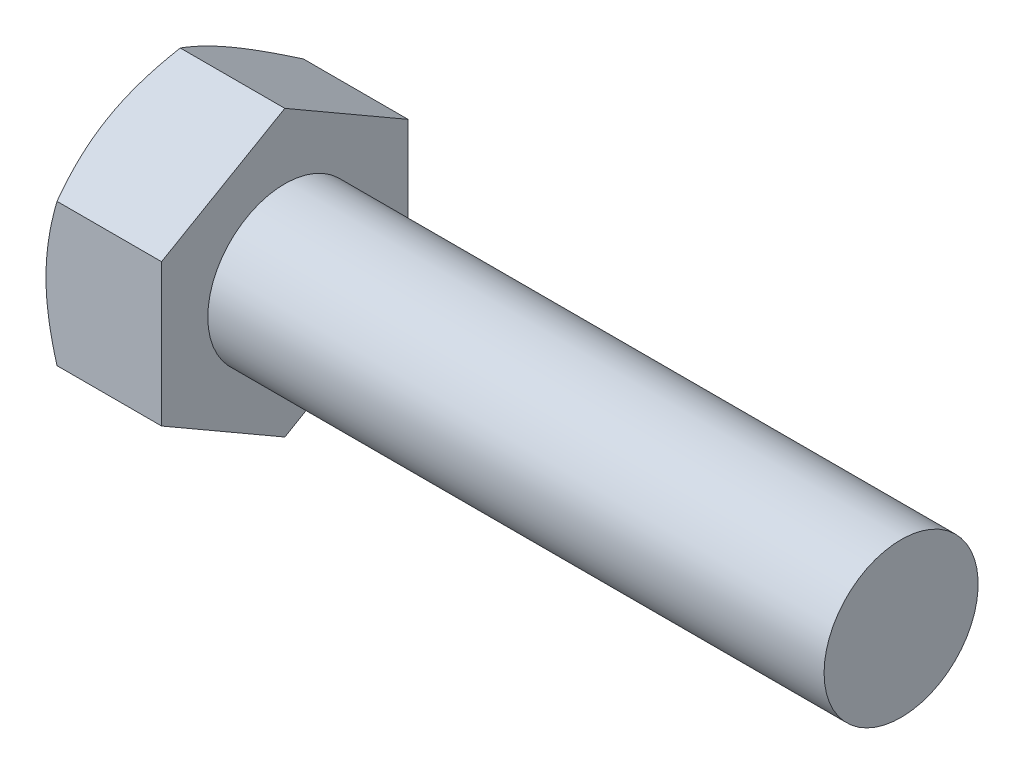
ISO-10303-21;
HEADER;
FILE_DESCRIPTION(('STEP AP214'),'2;1');
FILE_NAME('part.step','',(''),(''),'','','');
FILE_SCHEMA(('AUTOMOTIVE_DESIGN { 1 0 10303 214 1 1 1 1 }'));
ENDSEC;
DATA;
#1=APPLICATION_CONTEXT('core data for automotive mechanical design processes');
#2=APPLICATION_PROTOCOL_DEFINITION('international standard','automotive_design',2000,#1);
#3=PRODUCT_CONTEXT('',#1,'mechanical');
#4=PRODUCT('Part','Part','',(#3));
#5=PRODUCT_RELATED_PRODUCT_CATEGORY('part','',(#4));
#6=PRODUCT_DEFINITION_FORMATION('','',#4);
#7=PRODUCT_DEFINITION_CONTEXT('part definition',#1,'design');
#8=PRODUCT_DEFINITION('design','',#6,#7);
#9=PRODUCT_DEFINITION_SHAPE('','',#8);
#10=(LENGTH_UNIT() NAMED_UNIT(*) SI_UNIT(.MILLI.,.METRE.));
#11=(NAMED_UNIT(*) PLANE_ANGLE_UNIT() SI_UNIT($,.RADIAN.));
#12=(NAMED_UNIT(*) SI_UNIT($,.STERADIAN.) SOLID_ANGLE_UNIT());
#13=UNCERTAINTY_MEASURE_WITH_UNIT(LENGTH_MEASURE(1.E-05),#10,'distance_accuracy_value','');
#14=(GEOMETRIC_REPRESENTATION_CONTEXT(3) GLOBAL_UNCERTAINTY_ASSIGNED_CONTEXT((#13)) GLOBAL_UNIT_ASSIGNED_CONTEXT((#10,
#11,#12)) REPRESENTATION_CONTEXT('',''));
#15=CARTESIAN_POINT('',(0.,0.,0.));
#16=DIRECTION('',(0.,0.,1.));
#17=DIRECTION('',(1.,0.,0.));
#18=AXIS2_PLACEMENT_3D('',#15,#16,#17);
#19=CARTESIAN_POINT('',(7.5,4.99999999999999,0.));
#20=DIRECTION('',(-1.,0.,0.));
#21=DIRECTION('',(0.,0.,1.));
#22=AXIS2_PLACEMENT_3D('',#19,#20,#21);
#23=PLANE('',#22);
#24=CARTESIAN_POINT('',(7.5,0.,0.));
#25=DIRECTION('',(-1.,0.,0.));
#26=DIRECTION('',(0.,0.,1.));
#27=AXIS2_PLACEMENT_3D('',#24,#25,#26);
#28=CIRCLE('',#27,4.99999999999999);
#29=CARTESIAN_POINT('',(7.5,0.,4.99999999999999));
#30=VERTEX_POINT('',#29);
#31=EDGE_CURVE('E191',#30,#30,#28,.T.);
#32=ORIENTED_EDGE('',*,*,#31,.T.);
#33=EDGE_LOOP('',(#32));
#34=FACE_BOUND('',#33,.T.);
#35=DIRECTION('',(0.,1.,0.));
#36=VECTOR('',#35,1.);
#37=CARTESIAN_POINT('',(7.5,-4.61880217370055,8.));
#38=LINE('',#37,#36);
#39=CARTESIAN_POINT('',(7.5,-4.61880217370055,8.));
#40=VERTEX_POINT('',#39);
#41=CARTESIAN_POINT('',(7.5,4.61880217370081,8.));
#42=VERTEX_POINT('',#41);
#43=EDGE_CURVE('E55',#40,#42,#38,.T.);
#44=ORIENTED_EDGE('',*,*,#43,.F.);
#45=DIRECTION('',(0.,0.50000000163871,0.866025402838329));
#46=VECTOR('',#45,1.);
#47=CARTESIAN_POINT('',(7.5,-9.23760434740123,0.));
#48=LINE('',#47,#46);
#49=CARTESIAN_POINT('',(7.5,-9.23760434740123,0.));
#50=VERTEX_POINT('',#49);
#51=EDGE_CURVE('E128',#50,#40,#48,.T.);
#52=ORIENTED_EDGE('',*,*,#51,.F.);
#53=DIRECTION('',(0.,-0.50000000163871,0.866025402838329));
#54=VECTOR('',#53,1.);
#55=CARTESIAN_POINT('',(7.5,-4.61880217370055,-8.));
#56=LINE('',#55,#54);
#57=CARTESIAN_POINT('',(7.5,-4.61880217370055,-8.));
#58=VERTEX_POINT('',#57);
#59=EDGE_CURVE('E126',#58,#50,#56,.T.);
#60=ORIENTED_EDGE('',*,*,#59,.F.);
#61=DIRECTION('',(0.,-1.,0.));
#62=VECTOR('',#61,1.);
#63=CARTESIAN_POINT('',(7.5,4.61880217370081,-8.));
#64=LINE('',#63,#62);
#65=CARTESIAN_POINT('',(7.5,4.61880217370081,-8.));
#66=VERTEX_POINT('',#65);
#67=EDGE_CURVE('E109',#66,#58,#64,.T.);
#68=ORIENTED_EDGE('',*,*,#67,.F.);
#69=DIRECTION('',(0.,-0.50000000163871,-0.866025402838329));
#70=VECTOR('',#69,1.);
#71=CARTESIAN_POINT('',(7.5,9.23760434740149,0.));
#72=LINE('',#71,#70);
#73=CARTESIAN_POINT('',(7.5,9.23760434740148,0.));
#74=VERTEX_POINT('',#73);
#75=EDGE_CURVE('E118',#74,#66,#72,.T.);
#76=ORIENTED_EDGE('',*,*,#75,.F.);
#77=DIRECTION('',(0.,0.50000000163871,-0.866025402838329));
#78=VECTOR('',#77,1.);
#79=CARTESIAN_POINT('',(7.5,4.61880217370081,8.));
#80=LINE('',#79,#78);
#81=EDGE_CURVE('E122',#42,#74,#80,.T.);
#82=ORIENTED_EDGE('',*,*,#81,.F.);
#83=EDGE_LOOP('',(#44,#52,#60,#68,#76,#82));
#84=FACE_BOUND('',#83,.T.);
#85=ADVANCED_FACE('F32',(#34,#84),#23,.F.);
#86=CARTESIAN_POINT('',(-25.4,0.,0.));
#87=DIRECTION('',(-1.,0.,0.));
#88=DIRECTION('',(0.,0.,1.));
#89=AXIS2_PLACEMENT_3D('',#86,#87,#88);
#90=CYLINDRICAL_SURFACE('',#89,4.99999999999999);
#91=CARTESIAN_POINT('',(47.5,0.,0.));
#92=DIRECTION('',(-1.,0.,0.));
#93=DIRECTION('',(0.,0.,1.));
#94=AXIS2_PLACEMENT_3D('',#91,#92,#93);
#95=CIRCLE('',#94,4.99999999999999);
#96=CARTESIAN_POINT('',(47.5,0.,4.99999999999999));
#97=VERTEX_POINT('',#96);
#98=EDGE_CURVE('E11',#97,#97,#95,.T.);
#99=ORIENTED_EDGE('',*,*,#98,.T.);
#100=EDGE_LOOP('',(#99));
#101=FACE_BOUND('',#100,.T.);
#102=ORIENTED_EDGE('',*,*,#31,.F.);
#103=EDGE_LOOP('',(#102));
#104=FACE_BOUND('',#103,.T.);
#105=ADVANCED_FACE('F34',(#101,#104),#90,.T.);
#106=CARTESIAN_POINT('',(47.5,4.99999999999999,0.));
#107=DIRECTION('',(1.,0.,0.));
#108=DIRECTION('',(0.,0.,-1.));
#109=AXIS2_PLACEMENT_3D('',#106,#107,#108);
#110=PLANE('',#109);
#111=ORIENTED_EDGE('',*,*,#98,.F.);
#112=EDGE_LOOP('',(#111));
#113=FACE_BOUND('',#112,.T.);
#114=ADVANCED_FACE('F174',(#113),#110,.T.);
#115=CARTESIAN_POINT('',(7.5,-4.61880217370055,8.));
#116=DIRECTION('',(0.,0.,1.));
#117=DIRECTION('',(1.,0.,0.));
#118=AXIS2_PLACEMENT_3D('',#115,#116,#117);
#119=PLANE('',#118);
#120=DIRECTION('',(-1.,0.,0.));
#121=VECTOR('',#120,1.);
#122=CARTESIAN_POINT('',(7.5,-4.61880217370055,8.));
#123=LINE('',#122,#121);
#124=CARTESIAN_POINT('',(0.714531185642818,-4.61880217370055,8.));
#125=VERTEX_POINT('',#124);
#126=EDGE_CURVE('E135',#40,#125,#123,.T.);
#127=ORIENTED_EDGE('',*,*,#126,.F.);
#128=ORIENTED_EDGE('',*,*,#43,.T.);
#129=DIRECTION('',(-1.,0.,0.));
#130=VECTOR('',#129,1.);
#131=CARTESIAN_POINT('',(7.5,4.61880217370081,8.));
#132=LINE('',#131,#130);
#133=CARTESIAN_POINT('',(0.714531185642892,4.61880217370081,8.));
#134=VERTEX_POINT('',#133);
#135=EDGE_CURVE('E134',#42,#134,#132,.T.);
#136=ORIENTED_EDGE('',*,*,#135,.T.);
#137=CARTESIAN_POINT('',(3.82822414101115,-12.2497656982226,8.));
#138=CARTESIAN_POINT('',(3.65848286879736,-11.8985202843054,8.));
#139=CARTESIAN_POINT('',(3.49042895769105,-11.546444421205,8.));
#140=CARTESIAN_POINT('',(3.15866007606797,-10.8401827517385,8.));
#141=CARTESIAN_POINT('',(2.99494585678538,-10.4859965928938,8.));
#142=CARTESIAN_POINT('',(2.67195812645104,-9.77315201266954,8.));
#143=CARTESIAN_POINT('',(2.51271538890513,-9.41447959727725,8.));
#144=CARTESIAN_POINT('',(2.20106973608564,-8.6941868708221,8.));
#145=CARTESIAN_POINT('',(2.04866646428538,-8.33256671458254,8.));
#146=CARTESIAN_POINT('',(1.75070912610617,-7.60131370455928,8.));
#147=CARTESIAN_POINT('',(1.60526212024156,-7.23163698414151,8.));
#148=CARTESIAN_POINT('',(1.3257593237083,-6.487924160903,8.));
#149=CARTESIAN_POINT('',(1.19170480039106,-6.11388757832081,8.));
#150=CARTESIAN_POINT('',(0.938589488850546,-5.36162356561332,8.));
#151=CARTESIAN_POINT('',(0.819496824182951,-4.98340697934676,8.));
#152=CARTESIAN_POINT('',(0.600170997908567,-4.22161055060635,8.));
#153=CARTESIAN_POINT('',(0.499931872278407,-3.83803244555409,8.));
#154=CARTESIAN_POINT('',(0.323186748232368,-3.06518689861531,8.));
#155=CARTESIAN_POINT('',(0.246687067909604,-2.67591797096946,8.));
#156=CARTESIAN_POINT('',(0.153572527253889,-2.08858914234208,8.));
#157=CARTESIAN_POINT('',(0.126138156302347,-1.89221786409481,8.));
#158=CARTESIAN_POINT('',(0.0790208692877611,-1.49855462524936,8.));
#159=CARTESIAN_POINT('',(0.0593371858268389,-1.30126275775715,8.));
#160=CARTESIAN_POINT('',(0.0282509892994623,-0.907276578206895,8.));
#161=CARTESIAN_POINT('',(0.0167970522476367,-0.710586340026116,8.));
#162=CARTESIAN_POINT('',(0.00223090595897309,-0.316897324952119,8.));
#163=CARTESIAN_POINT('',(-0.000881411608058955,-0.119898552098996,8.));
#164=CARTESIAN_POINT('',(0.00130984053934708,0.273997538414059,8.));
#165=CARTESIAN_POINT('',(0.00661104833169363,0.470894869030628,8.));
#166=CARTESIAN_POINT('',(0.0254975236721262,0.864294473957555,8.));
#167=CARTESIAN_POINT('',(0.0390832049236083,1.0607967280472,8.));
#168=CARTESIAN_POINT('',(0.0817669665798442,1.53705699197599,8.));
#169=CARTESIAN_POINT('',(0.115015825491789,1.81644908989183,8.));
#170=CARTESIAN_POINT('',(0.196415724202102,2.37309234461894,8.));
#171=CARTESIAN_POINT('',(0.244570831513711,2.65034289586915,8.));
#172=CARTESIAN_POINT('',(0.354075319593898,3.20247432368565,8.));
#173=CARTESIAN_POINT('',(0.415437175577189,3.47735270235345,8.));
#174=CARTESIAN_POINT('',(0.549482936842536,4.02428135859503,8.));
#175=CARTESIAN_POINT('',(0.622165775535718,4.29633190001608,8.));
#176=CARTESIAN_POINT('',(0.779014575856637,4.8443054564892,8.));
#177=CARTESIAN_POINT('',(0.863418343438948,5.12015993256326,8.));
#178=CARTESIAN_POINT('',(1.04056550506418,5.66895309638316,8.));
#179=CARTESIAN_POINT('',(1.13330314694986,5.9418936519788,8.));
#180=CARTESIAN_POINT('',(1.32520246628365,6.48376376437685,8.));
#181=CARTESIAN_POINT('',(1.42432504691621,6.75270725047685,8.));
#182=CARTESIAN_POINT('',(1.62838816906517,7.28850759026013,8.));
#183=CARTESIAN_POINT('',(1.73333106198455,7.55536355016898,8.));
#184=CARTESIAN_POINT('',(1.84060835471515,7.82125004980533,8.));
#185=B_SPLINE_CURVE_WITH_KNOTS('',3,(#137,#138,#139,#140,#141,#142,#143,#144,#145,#146,#147,
#148,#149,#150,#151,#152,#153,#154,#155,#156,#157,#158,#159,#160,#161,#162,#163,#164,#165,#166,
#167,#168,#169,#170,#171,#172,#173,#174,#175,#176,#177,#178,#179,#180,#181,#182,#183,#184),
.UNSPECIFIED.,.F.,.F.,(4,2,2,2,2,2,2,2,2,2,2,2,2,2,2,2,2,2,2,2,2,2,2,4),(0.,1.17034426617222,
2.34088982216394,3.51813389970139,4.6953165385788,5.88695165739568,7.0787191660535,
8.26790291341459,9.45670984600031,10.6458329007115,11.2405391306507,11.8351864637341,
12.4260850123376,13.0169758870758,13.6077009108411,14.1984554361754,15.0420758899104,
15.8859267481502,16.7305782416716,17.5751502057393,18.4404245595524,19.3051062097702,
20.1649208601746,21.0250854420212),.UNSPECIFIED.);
#186=CARTESIAN_POINT('',(0.,0.,8.));
#187=VERTEX_POINT('',#186);
#188=EDGE_CURVE('E176',#187,#134,#185,.T.);
#189=ORIENTED_EDGE('',*,*,#188,.F.);
#190=EDGE_CURVE('E183',#125,#187,#185,.T.);
#191=ORIENTED_EDGE('',*,*,#190,.F.);
#192=EDGE_LOOP('',(#127,#128,#136,#189,#191));
#193=FACE_BOUND('',#192,.T.);
#194=ADVANCED_FACE('F170',(#193),#119,.T.);
#195=CARTESIAN_POINT('',(7.5,-9.23760434740123,0.));
#196=DIRECTION('',(0.,-0.866025402838329,0.50000000163871));
#197=DIRECTION('',(0.,-0.50000000163871,-0.866025402838329));
#198=AXIS2_PLACEMENT_3D('',#195,#196,#197);
#199=PLANE('',#198);
#200=DIRECTION('',(-1.,0.,0.));
#201=VECTOR('',#200,1.);
#202=CARTESIAN_POINT('',(7.5,-9.23760434740123,0.));
#203=LINE('',#202,#201);
#204=CARTESIAN_POINT('',(0.714531203122354,-9.23760434740123,0.));
#205=VERTEX_POINT('',#204);
#206=EDGE_CURVE('E139',#50,#205,#203,.T.);
#207=ORIENTED_EDGE('',*,*,#206,.F.);
#208=ORIENTED_EDGE('',*,*,#51,.T.);
#209=ORIENTED_EDGE('',*,*,#126,.T.);
#210=CARTESIAN_POINT('',(0.714597871039296,-9.23771981745557,-0.0002000000000001));
#211=CARTESIAN_POINT('',(0.655990736923309,-9.13619347400029,0.175648784402794));
#212=CARTESIAN_POINT('',(0.600043423495622,-9.03428860437913,0.352153195354024));
#213=CARTESIAN_POINT('',(0.494201026626139,-8.82965126370277,0.706595464982377));
#214=CARTESIAN_POINT('',(0.444308555613364,-8.72691845566661,0.884533907327669));
#215=CARTESIAN_POINT('',(0.304692817146088,-8.41707515629909,1.42119824187181));
#216=CARTESIAN_POINT('',(0.225281190112565,-8.20874157525887,1.78204258757938));
#217=CARTESIAN_POINT('',(0.13216166430539,-7.89697439751329,2.32203917720736));
#218=CARTESIAN_POINT('',(0.105634598683684,-7.79447219608365,2.49957819719533));
#219=CARTESIAN_POINT('',(0.0611531918321849,-7.58900424766936,2.85545912162067));
#220=CARTESIAN_POINT('',(0.0431980931629744,-7.4860385424529,3.03380095371339));
#221=CARTESIAN_POINT('',(0.0163156645301174,-7.27992984087247,3.39079169517274));
#222=CARTESIAN_POINT('',(0.00737808929917002,-7.17678717937825,3.56944002452793));
#223=CARTESIAN_POINT('',(-0.00127768080582724,-6.97040657400776,3.92690171716438));
#224=CARTESIAN_POINT('',(-0.000996160506699113,-6.86716863317371,4.10571507517634));
#225=CARTESIAN_POINT('',(0.00814503983248963,-6.67416141624368,4.44001337966577));
#226=CARTESIAN_POINT('',(0.0158896186877223,-6.58437852030024,4.59552191641092));
#227=CARTESIAN_POINT('',(0.038201148635654,-6.40502300933048,4.90617477267052));
#228=CARTESIAN_POINT('',(0.0527685596255939,-6.31545040888835,5.06131906692438));
#229=CARTESIAN_POINT('',(0.106360703064383,-6.04707937863194,5.52615132457682));
#230=CARTESIAN_POINT('',(0.155268653484361,-5.86875598870038,5.83501649476649));
#231=CARTESIAN_POINT('',(0.277539413477514,-5.51021757899271,6.45602323413139));
#232=CARTESIAN_POINT('',(0.351420529762541,-5.33004831822991,6.768085546371));
#233=CARTESIAN_POINT('',(0.519100148881203,-4.97239660419655,7.38755648378386));
#234=CARTESIAN_POINT('',(0.612859267577921,-4.79490957082323,7.69497304192775));
#235=CARTESIAN_POINT('',(0.714597853559104,-4.61868670364621,8.0002));
#236=B_SPLINE_CURVE_WITH_KNOTS('',3,(#210,#211,#212,#213,#214,#215,#216,#217,#218,#219,#220,
#221,#222,#223,#224,#225,#226,#227,#228,#229,#230,#231,#232,#233,#234,#235),.UNSPECIFIED.,.F.,
.F.,(4,2,2,2,2,2,2,2,2,2,2,2,4),(0.,0.633973546459013,1.26821966262013,2.53934713534089,
3.15934345345195,3.77928497706708,4.39852135771862,5.01773860688775,5.55680241439714,
6.09590256306805,7.17487079008232,8.27776851436756,9.37850116222514),.UNSPECIFIED.);
#237=CARTESIAN_POINT('',(0.,-6.92820324541317,4.0000000262193));
#238=VERTEX_POINT('',#237);
#239=EDGE_CURVE('E185',#238,#125,#236,.T.);
#240=ORIENTED_EDGE('',*,*,#239,.F.);
#241=EDGE_CURVE('E184',#205,#238,#236,.T.);
#242=ORIENTED_EDGE('',*,*,#241,.F.);
#243=EDGE_LOOP('',(#207,#208,#209,#240,#242));
#244=FACE_BOUND('',#243,.T.);
#245=ADVANCED_FACE('F173',(#244),#199,.T.);
#246=CARTESIAN_POINT('',(7.5,-4.61880217370055,-8.));
#247=DIRECTION('',(0.,-0.866025402838329,-0.50000000163871));
#248=DIRECTION('',(0.,0.50000000163871,-0.866025402838329));
#249=AXIS2_PLACEMENT_3D('',#246,#247,#248);
#250=PLANE('',#249);
#251=DIRECTION('',(-1.,0.,0.));
#252=VECTOR('',#251,1.);
#253=CARTESIAN_POINT('',(7.5,-4.61880217370055,-8.));
#254=LINE('',#253,#252);
#255=CARTESIAN_POINT('',(0.714531185642818,-4.61880217370055,-8.));
#256=VERTEX_POINT('',#255);
#257=EDGE_CURVE('E115',#58,#256,#254,.T.);
#258=ORIENTED_EDGE('',*,*,#257,.F.);
#259=ORIENTED_EDGE('',*,*,#59,.T.);
#260=ORIENTED_EDGE('',*,*,#206,.T.);
#261=CARTESIAN_POINT('',(0.714597853559106,-4.61868670364621,-8.0002));
#262=CARTESIAN_POINT('',(0.65599072016066,-4.72021304685638,-7.82435121602175));
#263=CARTESIAN_POINT('',(0.600043407468515,-4.82211791623125,-7.64784680549711));
#264=CARTESIAN_POINT('',(0.494201012103506,-5.02675525640989,-7.29340453673082));
#265=CARTESIAN_POINT('',(0.444308541859676,-5.12948806419463,-7.11546609482101));
#266=CARTESIAN_POINT('',(0.304692805754272,-5.43933136278073,-6.57880176163032));
#267=CARTESIAN_POINT('',(0.22528118035716,-5.64766494327923,-6.21795741686103));
#268=CARTESIAN_POINT('',(0.132161657001103,-5.95943212018714,-5.67796082868395));
#269=CARTESIAN_POINT('',(0.105634592184737,-6.06193432134328,-5.5004218091697));
#270=CARTESIAN_POINT('',(0.0611531869346983,-6.2674022691947,-5.14454088571928));
#271=CARTESIAN_POINT('',(0.0431980890616169,-6.37036797412179,-4.96619905412775));
#272=CARTESIAN_POINT('',(0.016315661991493,-6.57647667510862,-4.60920831369654));
#273=CARTESIAN_POINT('',(0.00737808752736497,-6.67961933629864,-4.43055998486825));
#274=CARTESIAN_POINT('',(-0.00127768109245089,-6.88599994104392,-4.07309829331471));
#275=CARTESIAN_POINT('',(-0.000996160074943611,-6.98923788155696,-3.89428493585874));
#276=CARTESIAN_POINT('',(0.00814504157394332,-7.18224509847458,-3.5599866313908));
#277=CARTESIAN_POINT('',(0.0158896210753668,-7.27202799472784,-3.40447809410903));
#278=CARTESIAN_POINT('',(0.0382011523455345,-7.45138350630451,-3.09382523679824));
#279=CARTESIAN_POINT('',(0.0527685640115304,-7.54095610704372,-2.93868094202981));
#280=CARTESIAN_POINT('',(0.106360709504685,-7.80932713817435,-2.47384868286318));
#281=CARTESIAN_POINT('',(0.155268661328175,-7.98765052866424,-2.16498351170646));
#282=CARTESIAN_POINT('',(0.277539424141205,-8.34618893947705,-1.54397677042741));
#283=CARTESIAN_POINT('',(0.351420541844043,-8.52635820078562,-1.23191445724248));
#284=CARTESIAN_POINT('',(0.519100163726603,-8.88400991587941,-0.612443517992906));
#285=CARTESIAN_POINT('',(0.612859283768849,-9.06149694976751,-0.305026958957409));
#286=CARTESIAN_POINT('',(0.714597871039296,-9.23771981745557,0.000199999999999587));
#287=B_SPLINE_CURVE_WITH_KNOTS('',3,(#261,#262,#263,#264,#265,#266,#267,#268,#269,#270,#271,
#272,#273,#274,#275,#276,#277,#278,#279,#280,#281,#282,#283,#284,#285,#286),.UNSPECIFIED.,.F.,
.F.,(4,2,2,2,2,2,2,2,2,2,2,2,4),(0.,0.633973544448733,1.26821965859846,2.539347127198,
3.1593434433715,3.77928496504979,4.39852134377931,5.01773859102754,5.55680240047657,
6.09590255108796,7.17487078199376,8.27776851034647,9.37850116222567),.UNSPECIFIED.);
#288=CARTESIAN_POINT('',(0.,-6.92820324541317,-4.0000000262193));
#289=VERTEX_POINT('',#288);
#290=EDGE_CURVE('E214',#289,#205,#287,.T.);
#291=ORIENTED_EDGE('',*,*,#290,.F.);
#292=EDGE_CURVE('E219',#256,#289,#287,.T.);
#293=ORIENTED_EDGE('',*,*,#292,.F.);
#294=EDGE_LOOP('',(#258,#259,#260,#291,#293));
#295=FACE_BOUND('',#294,.T.);
#296=ADVANCED_FACE('F288',(#295),#250,.T.);
#297=CARTESIAN_POINT('',(7.5,4.61880217370081,-8.));
#298=DIRECTION('',(0.,0.,-1.));
#299=DIRECTION('',(-1.,0.,0.));
#300=AXIS2_PLACEMENT_3D('',#297,#298,#299);
#301=PLANE('',#300);
#302=DIRECTION('',(-1.,0.,0.));
#303=VECTOR('',#302,1.);
#304=CARTESIAN_POINT('',(7.5,4.61880217370081,-8.));
#305=LINE('',#304,#303);
#306=CARTESIAN_POINT('',(0.714531185642892,4.61880217370081,-8.));
#307=VERTEX_POINT('',#306);
#308=EDGE_CURVE('E104',#66,#307,#305,.T.);
#309=ORIENTED_EDGE('',*,*,#308,.F.);
#310=ORIENTED_EDGE('',*,*,#67,.T.);
#311=ORIENTED_EDGE('',*,*,#257,.T.);
#312=CARTESIAN_POINT('',(3.82822414101115,-12.2497656982226,-8.));
#313=CARTESIAN_POINT('',(3.65848286879736,-11.8985202843054,-8.));
#314=CARTESIAN_POINT('',(3.49042895769105,-11.546444421205,-8.));
#315=CARTESIAN_POINT('',(3.15866007606797,-10.8401827517385,-8.));
#316=CARTESIAN_POINT('',(2.99494585678538,-10.4859965928938,-8.));
#317=CARTESIAN_POINT('',(2.67195812645104,-9.77315201266954,-8.));
#318=CARTESIAN_POINT('',(2.51271538890513,-9.41447959727725,-8.));
#319=CARTESIAN_POINT('',(2.20106973608564,-8.6941868708221,-8.));
#320=CARTESIAN_POINT('',(2.04866646428538,-8.33256671458254,-8.));
#321=CARTESIAN_POINT('',(1.75070912610617,-7.60131370455928,-8.));
#322=CARTESIAN_POINT('',(1.60526212024156,-7.23163698414151,-8.));
#323=CARTESIAN_POINT('',(1.3257593237083,-6.487924160903,-8.));
#324=CARTESIAN_POINT('',(1.19170480039106,-6.11388757832081,-8.));
#325=CARTESIAN_POINT('',(0.938589488850546,-5.36162356561332,-8.));
#326=CARTESIAN_POINT('',(0.819496824182951,-4.98340697934676,-8.));
#327=CARTESIAN_POINT('',(0.600170997908567,-4.22161055060635,-8.));
#328=CARTESIAN_POINT('',(0.499931872278407,-3.83803244555409,-8.));
#329=CARTESIAN_POINT('',(0.323186748232368,-3.06518689861531,-8.));
#330=CARTESIAN_POINT('',(0.246687067909604,-2.67591797096946,-8.));
#331=CARTESIAN_POINT('',(0.153572527253889,-2.08858914234208,-8.));
#332=CARTESIAN_POINT('',(0.126138156302347,-1.89221786409481,-8.));
#333=CARTESIAN_POINT('',(0.0790208692877611,-1.49855462524936,-8.));
#334=CARTESIAN_POINT('',(0.0593371858268389,-1.30126275775715,-8.));
#335=CARTESIAN_POINT('',(0.0282509892994623,-0.907276578206895,-8.));
#336=CARTESIAN_POINT('',(0.0167970522476367,-0.710586340026116,-8.));
#337=CARTESIAN_POINT('',(0.00223090595897309,-0.316897324952119,-8.));
#338=CARTESIAN_POINT('',(-0.000881411608058955,-0.119898552098996,-8.));
#339=CARTESIAN_POINT('',(0.00130984053934708,0.273997538414059,-8.));
#340=CARTESIAN_POINT('',(0.00661104833169363,0.470894869030628,-8.));
#341=CARTESIAN_POINT('',(0.0254975236721262,0.864294473957555,-8.));
#342=CARTESIAN_POINT('',(0.0390832049236083,1.0607967280472,-8.));
#343=CARTESIAN_POINT('',(0.0817669665798442,1.53705699197599,-8.));
#344=CARTESIAN_POINT('',(0.115015825491789,1.81644908989183,-8.));
#345=CARTESIAN_POINT('',(0.196415724202102,2.37309234461894,-8.));
#346=CARTESIAN_POINT('',(0.244570831513711,2.65034289586915,-8.));
#347=CARTESIAN_POINT('',(0.354075319593898,3.20247432368565,-8.));
#348=CARTESIAN_POINT('',(0.415437175577189,3.47735270235345,-8.));
#349=CARTESIAN_POINT('',(0.549482936842536,4.02428135859503,-8.));
#350=CARTESIAN_POINT('',(0.622165775535718,4.29633190001608,-8.));
#351=CARTESIAN_POINT('',(0.779014575856637,4.8443054564892,-8.));
#352=CARTESIAN_POINT('',(0.863418343438948,5.12015993256326,-8.));
#353=CARTESIAN_POINT('',(1.04056550506418,5.66895309638316,-8.));
#354=CARTESIAN_POINT('',(1.13330314694986,5.9418936519788,-8.));
#355=CARTESIAN_POINT('',(1.32520246628365,6.48376376437685,-8.));
#356=CARTESIAN_POINT('',(1.42432504691621,6.75270725047685,-8.));
#357=CARTESIAN_POINT('',(1.62838816906517,7.28850759026013,-8.));
#358=CARTESIAN_POINT('',(1.73333106198455,7.55536355016898,-8.));
#359=CARTESIAN_POINT('',(1.84060835471515,7.82125004980533,-8.));
#360=B_SPLINE_CURVE_WITH_KNOTS('',3,(#312,#313,#314,#315,#316,#317,#318,#319,#320,#321,#322,
#323,#324,#325,#326,#327,#328,#329,#330,#331,#332,#333,#334,#335,#336,#337,#338,#339,#340,#341,
#342,#343,#344,#345,#346,#347,#348,#349,#350,#351,#352,#353,#354,#355,#356,#357,#358,#359),
.UNSPECIFIED.,.F.,.F.,(4,2,2,2,2,2,2,2,2,2,2,2,2,2,2,2,2,2,2,2,2,2,2,4),(0.,1.17034426617222,
2.34088982216394,3.51813389970139,4.6953165385788,5.88695165739568,7.0787191660535,
8.26790291341459,9.45670984600031,10.6458329007115,11.2405391306507,11.8351864637341,
12.4260850123376,13.0169758870758,13.6077009108411,14.1984554361754,15.0420758899104,
15.8859267481502,16.7305782416716,17.5751502057393,18.4404245595524,19.3051062097702,
20.1649208601746,21.0250854420212),.UNSPECIFIED.);
#361=CARTESIAN_POINT('',(0.,0.,-8.));
#362=VERTEX_POINT('',#361);
#363=EDGE_CURVE('E215',#362,#256,#360,.F.);
#364=ORIENTED_EDGE('',*,*,#363,.F.);
#365=EDGE_CURVE('E112',#307,#362,#360,.F.);
#366=ORIENTED_EDGE('',*,*,#365,.F.);
#367=EDGE_LOOP('',(#309,#310,#311,#364,#366));
#368=FACE_BOUND('',#367,.T.);
#369=ADVANCED_FACE('F106',(#368),#301,.T.);
#370=CARTESIAN_POINT('',(7.5,9.23760434740149,0.));
#371=DIRECTION('',(0.,0.866025402838329,-0.50000000163871));
#372=DIRECTION('',(0.,0.50000000163871,0.866025402838329));
#373=AXIS2_PLACEMENT_3D('',#370,#371,#372);
#374=PLANE('',#373);
#375=DIRECTION('',(-1.,0.,0.));
#376=VECTOR('',#375,1.);
#377=CARTESIAN_POINT('',(7.5,9.23760434740149,0.));
#378=LINE('',#377,#376);
#379=CARTESIAN_POINT('',(0.714531203122502,9.23760434740149,0.));
#380=VERTEX_POINT('',#379);
#381=EDGE_CURVE('E47',#74,#380,#378,.T.);
#382=ORIENTED_EDGE('',*,*,#381,.F.);
#383=ORIENTED_EDGE('',*,*,#75,.T.);
#384=ORIENTED_EDGE('',*,*,#308,.T.);
#385=CARTESIAN_POINT('',(0.714597871039444,9.23771981745583,0.000200000000000146));
#386=CARTESIAN_POINT('',(0.655990736923456,9.13619347400054,-0.175648784402799));
#387=CARTESIAN_POINT('',(0.600043423495768,9.03428860437938,-0.352153195354034));
#388=CARTESIAN_POINT('',(0.494201026626282,8.82965126370302,-0.706595464982396));
#389=CARTESIAN_POINT('',(0.444308555613505,8.72691845566685,-0.884533907327693));
#390=CARTESIAN_POINT('',(0.304692817146224,8.41707515629933,-1.42119824187185));
#391=CARTESIAN_POINT('',(0.2252811901127,8.2087415752591,-1.78204258757943));
#392=CARTESIAN_POINT('',(0.132161664305522,7.89697439751352,-2.32203917720742));
#393=CARTESIAN_POINT('',(0.105634598683815,7.79447219608387,-2.4995781971954));
#394=CARTESIAN_POINT('',(0.0611531918323152,7.58900424766957,-2.85545912162075));
#395=CARTESIAN_POINT('',(0.0431980931631046,7.48603854245311,-3.03380095371348));
#396=CARTESIAN_POINT('',(0.0163156645302469,7.27992984087268,-3.39079169517283));
#397=CARTESIAN_POINT('',(0.00737808929929885,7.17678717937845,-3.56944002452803));
#398=CARTESIAN_POINT('',(-0.00127768080569918,6.97040657400795,-3.92690171716449));
#399=CARTESIAN_POINT('',(-0.000996160506571202,6.8671686331739,-4.10571507517646));
#400=CARTESIAN_POINT('',(0.00814503983261781,6.67416141624387,-4.44001337966589));
#401=CARTESIAN_POINT('',(0.0158896186878504,6.58437852030044,-4.59552191641103));
#402=CARTESIAN_POINT('',(0.0382011486357808,6.40502300933068,-4.90617477267062));
#403=CARTESIAN_POINT('',(0.0527685596257195,6.31545040888856,-5.06131906692447));
#404=CARTESIAN_POINT('',(0.106360703064504,6.04707937863215,-5.5261513245769));
#405=CARTESIAN_POINT('',(0.155268653484479,5.8687559887006,-5.83501649476656));
#406=CARTESIAN_POINT('',(0.277539413477622,5.51021757899294,-6.45602323413144));
#407=CARTESIAN_POINT('',(0.351420529762643,5.33004831823015,-6.76808554637104));
#408=CARTESIAN_POINT('',(0.519100148881291,4.97239660419679,-7.38755648378388));
#409=CARTESIAN_POINT('',(0.612859267578002,4.79490957082348,-7.69497304192776));
#410=CARTESIAN_POINT('',(0.714597853559178,4.61868670364646,-8.0002));
#411=B_SPLINE_CURVE_WITH_KNOTS('',3,(#385,#386,#387,#388,#389,#390,#391,#392,#393,#394,#395,
#396,#397,#398,#399,#400,#401,#402,#403,#404,#405,#406,#407,#408,#409,#410),.UNSPECIFIED.,.F.,
.F.,(4,2,2,2,2,2,2,2,2,2,2,2,4),(0.,0.63397354645903,1.26821966262016,2.53934713534096,
3.15934345345203,3.77928497706718,4.39852135771874,5.01773860688789,5.55680241439726,
6.09590256306816,7.17487079008239,8.27776851436759,9.37850116222513),.UNSPECIFIED.);
#412=CARTESIAN_POINT('',(0.,6.92820324541336,-4.00000002621942));
#413=VERTEX_POINT('',#412);
#414=EDGE_CURVE('E153',#413,#307,#411,.T.);
#415=ORIENTED_EDGE('',*,*,#414,.F.);
#416=EDGE_CURVE('E278',#380,#413,#411,.T.);
#417=ORIENTED_EDGE('',*,*,#416,.F.);
#418=EDGE_LOOP('',(#382,#383,#384,#415,#417));
#419=FACE_BOUND('',#418,.T.);
#420=ADVANCED_FACE('F119',(#419),#374,.T.);
#421=CARTESIAN_POINT('',(7.5,4.61880217370081,8.));
#422=DIRECTION('',(0.,0.866025402838329,0.50000000163871));
#423=DIRECTION('',(0.,-0.50000000163871,0.866025402838329));
#424=AXIS2_PLACEMENT_3D('',#421,#422,#423);
#425=PLANE('',#424);
#426=ORIENTED_EDGE('',*,*,#135,.F.);
#427=ORIENTED_EDGE('',*,*,#81,.T.);
#428=ORIENTED_EDGE('',*,*,#381,.T.);
#429=CARTESIAN_POINT('',(0.714597853559179,4.61868670364646,8.0002));
#430=CARTESIAN_POINT('',(0.655990720160735,4.72021304685664,7.82435121602175));
#431=CARTESIAN_POINT('',(0.600043407468591,4.82211791623151,7.6478468054971));
#432=CARTESIAN_POINT('',(0.494201012103586,5.02675525641015,7.29340453673081));
#433=CARTESIAN_POINT('',(0.444308541859758,5.1294880641949,7.11546609482099));
#434=CARTESIAN_POINT('',(0.30469280575436,5.439331362781,6.57880176163029));
#435=CARTESIAN_POINT('',(0.225281180357251,5.6476649432795,6.217957416861));
#436=CARTESIAN_POINT('',(0.132161657001203,5.95943212018742,5.67796082868391));
#437=CARTESIAN_POINT('',(0.105634592184841,6.06193432134356,5.50042180916966));
#438=CARTESIAN_POINT('',(0.0611531869348079,6.26740226919499,5.14454088571923));
#439=CARTESIAN_POINT('',(0.0431980890617282,6.37036797412208,4.9661990541277));
#440=CARTESIAN_POINT('',(0.0163156619916095,6.57647667510891,4.60920831369649));
#441=CARTESIAN_POINT('',(0.00737808752748518,6.67961933629893,4.43055998486819));
#442=CARTESIAN_POINT('',(-0.00127768109232372,6.88599994104421,4.07309829331464));
#443=CARTESIAN_POINT('',(-0.000996160074813141,6.98923788155725,3.89428493585868));
#444=CARTESIAN_POINT('',(0.00814504157407925,7.18224509847487,3.55998663139074));
#445=CARTESIAN_POINT('',(0.0158896210755048,7.27202799472813,3.40447809410897));
#446=CARTESIAN_POINT('',(0.0382011523456765,7.4513835063048,3.09382523679819));
#447=CARTESIAN_POINT('',(0.0527685640116745,7.54095610704401,2.93868094202976));
#448=CARTESIAN_POINT('',(0.106360709504834,7.80932713817463,2.47384868286313));
#449=CARTESIAN_POINT('',(0.155268661328325,7.98765052866452,2.16498351170642));
#450=CARTESIAN_POINT('',(0.277539424141357,8.34618893947732,1.54397677042737));
#451=CARTESIAN_POINT('',(0.351420541844195,8.5263582007859,1.23191445724245));
#452=CARTESIAN_POINT('',(0.519100163726754,8.88400991587968,0.612443517992892));
#453=CARTESIAN_POINT('',(0.612859283769,9.06149694976777,0.305026958957401));
#454=CARTESIAN_POINT('',(0.714597871039444,9.23771981745583,-0.000200000000001654));
#455=B_SPLINE_CURVE_WITH_KNOTS('',3,(#429,#430,#431,#432,#433,#434,#435,#436,#437,#438,#439,
#440,#441,#442,#443,#444,#445,#446,#447,#448,#449,#450,#451,#452,#453,#454),.UNSPECIFIED.,.F.,
.F.,(4,2,2,2,2,2,2,2,2,2,2,2,4),(0.,0.633973544448742,1.26821965859848,2.53934712719804,
3.15934344337154,3.77928496504984,4.39852134377938,5.01773859102761,5.55680240047663,
6.09590255108801,7.1748707819938,8.27776851034648,9.37850116222566),.UNSPECIFIED.);
#456=CARTESIAN_POINT('',(0.,6.92820324541336,4.00000002621942));
#457=VERTEX_POINT('',#456);
#458=EDGE_CURVE('E138',#457,#380,#455,.T.);
#459=ORIENTED_EDGE('',*,*,#458,.F.);
#460=EDGE_CURVE('E152',#134,#457,#455,.T.);
#461=ORIENTED_EDGE('',*,*,#460,.F.);
#462=EDGE_LOOP('',(#426,#427,#428,#459,#461));
#463=FACE_BOUND('',#462,.T.);
#464=ADVANCED_FACE('F163',(#463),#425,.T.);
#465=CARTESIAN_POINT('',(0.,0.,0.));
#466=DIRECTION('',(1.,0.,0.));
#467=DIRECTION('',(0.,0.,-1.));
#468=AXIS2_PLACEMENT_3D('',#465,#466,#467);
#469=CONICAL_SURFACE('',#468,7.99999999999999,1.0471975511966);
#470=CARTESIAN_POINT('',(0.,0.,0.));
#471=DIRECTION('',(-1.,0.,0.));
#472=DIRECTION('',(0.,0.,1.));
#473=AXIS2_PLACEMENT_3D('',#470,#471,#472);
#474=CIRCLE('',#473,7.99999999999999);
#475=EDGE_CURVE('E193',#238,#187,#474,.T.);
#476=ORIENTED_EDGE('',*,*,#475,.F.);
#477=ORIENTED_EDGE('',*,*,#239,.T.);
#478=ORIENTED_EDGE('',*,*,#190,.T.);
#479=EDGE_LOOP('',(#476,#477,#478));
#480=FACE_BOUND('',#479,.T.);
#481=ADVANCED_FACE('F167',(#480),#469,.T.);
#482=EDGE_CURVE('E201',#289,#238,#474,.T.);
#483=ORIENTED_EDGE('',*,*,#482,.F.);
#484=ORIENTED_EDGE('',*,*,#290,.T.);
#485=ORIENTED_EDGE('',*,*,#241,.T.);
#486=EDGE_LOOP('',(#483,#484,#485));
#487=FACE_BOUND('',#486,.T.);
#488=ADVANCED_FACE('F224',(#487),#469,.T.);
#489=ORIENTED_EDGE('',*,*,#363,.T.);
#490=ORIENTED_EDGE('',*,*,#292,.T.);
#491=EDGE_CURVE('E204',#362,#289,#474,.T.);
#492=ORIENTED_EDGE('',*,*,#491,.F.);
#493=EDGE_LOOP('',(#489,#490,#492));
#494=FACE_BOUND('',#493,.T.);
#495=ADVANCED_FACE('F159',(#494),#469,.T.);
#496=ORIENTED_EDGE('',*,*,#414,.T.);
#497=ORIENTED_EDGE('',*,*,#365,.T.);
#498=EDGE_CURVE('E200',#413,#362,#474,.T.);
#499=ORIENTED_EDGE('',*,*,#498,.F.);
#500=EDGE_LOOP('',(#496,#497,#499));
#501=FACE_BOUND('',#500,.T.);
#502=ADVANCED_FACE('F213',(#501),#469,.T.);
#503=EDGE_CURVE('E40',#187,#457,#474,.T.);
#504=ORIENTED_EDGE('',*,*,#503,.F.);
#505=ORIENTED_EDGE('',*,*,#188,.T.);
#506=ORIENTED_EDGE('',*,*,#460,.T.);
#507=EDGE_LOOP('',(#504,#505,#506));
#508=FACE_BOUND('',#507,.T.);
#509=ADVANCED_FACE('F252',(#508),#469,.T.);
#510=CARTESIAN_POINT('',(0.,0.,0.));
#511=DIRECTION('',(-1.,0.,0.));
#512=DIRECTION('',(0.,0.,1.));
#513=AXIS2_PLACEMENT_3D('',#510,#511,#512);
#514=PLANE('',#513);
#515=CARTESIAN_POINT('',(0.,0.,0.));
#516=DIRECTION('',(1.,0.,0.));
#517=DIRECTION('',(0.,0.,-1.));
#518=AXIS2_PLACEMENT_3D('',#515,#516,#517);
#519=CIRCLE('',#518,7.);
#520=CARTESIAN_POINT('',(0.,0.,-7.));
#521=VERTEX_POINT('',#520);
#522=EDGE_CURVE('E232',#521,#521,#519,.T.);
#523=ORIENTED_EDGE('',*,*,#522,.T.);
#524=EDGE_LOOP('',(#523));
#525=FACE_BOUND('',#524,.T.);
#526=ORIENTED_EDGE('',*,*,#503,.T.);
#527=EDGE_CURVE('E195',#457,#413,#474,.T.);
#528=ORIENTED_EDGE('',*,*,#527,.T.);
#529=ORIENTED_EDGE('',*,*,#498,.T.);
#530=ORIENTED_EDGE('',*,*,#491,.T.);
#531=ORIENTED_EDGE('',*,*,#482,.T.);
#532=ORIENTED_EDGE('',*,*,#475,.T.);
#533=EDGE_LOOP('',(#526,#528,#529,#530,#531,#532));
#534=FACE_BOUND('',#533,.T.);
#535=ADVANCED_FACE('F210',(#525,#534),#514,.T.);
#536=ORIENTED_EDGE('',*,*,#458,.T.);
#537=ORIENTED_EDGE('',*,*,#416,.T.);
#538=ORIENTED_EDGE('',*,*,#527,.F.);
#539=EDGE_LOOP('',(#536,#537,#538));
#540=FACE_BOUND('',#539,.T.);
#541=ADVANCED_FACE('F242',(#540),#469,.T.);
#542=CARTESIAN_POINT('',(0.9375,0.,0.));
#543=DIRECTION('',(-1.,0.,0.));
#544=DIRECTION('',(0.,0.,1.));
#545=AXIS2_PLACEMENT_3D('',#542,#543,#544);
#546=CYLINDRICAL_SURFACE('',#545,7.);
#547=CARTESIAN_POINT('',(0.9375,0.,0.));
#548=DIRECTION('',(1.,0.,0.));
#549=DIRECTION('',(0.,0.,-1.));
#550=AXIS2_PLACEMENT_3D('',#547,#548,#549);
#551=CIRCLE('',#550,7.);
#552=CARTESIAN_POINT('',(0.9375,0.,-7.));
#553=VERTEX_POINT('',#552);
#554=EDGE_CURVE('E229',#553,#553,#551,.T.);
#555=ORIENTED_EDGE('',*,*,#554,.T.);
#556=EDGE_LOOP('',(#555));
#557=FACE_BOUND('',#556,.T.);
#558=ORIENTED_EDGE('',*,*,#522,.F.);
#559=EDGE_LOOP('',(#558));
#560=FACE_BOUND('',#559,.T.);
#561=ADVANCED_FACE('F239',(#557,#560),#546,.F.);
#562=CARTESIAN_POINT('',(0.9375,0.,0.));
#563=DIRECTION('',(1.,0.,0.));
#564=DIRECTION('',(0.,0.,-1.));
#565=AXIS2_PLACEMENT_3D('',#562,#563,#564);
#566=PLANE('',#565);
#567=ORIENTED_EDGE('',*,*,#554,.F.);
#568=EDGE_LOOP('',(#567));
#569=FACE_BOUND('',#568,.T.);
#570=ADVANCED_FACE('F241',(#569),#566,.F.);
#571=CLOSED_SHELL('',(#85,#105,#114,#194,#245,#296,#369,#420,#464,#481,#488,#495,#502,#509,#535,
#541,#561,#570));
#572=MANIFOLD_SOLID_BREP('B2',#571);
#573=ADVANCED_BREP_SHAPE_REPRESENTATION('',(#18,#572),#14);
#574=SHAPE_DEFINITION_REPRESENTATION(#9,#573);
ENDSEC;
END-ISO-10303-21;
